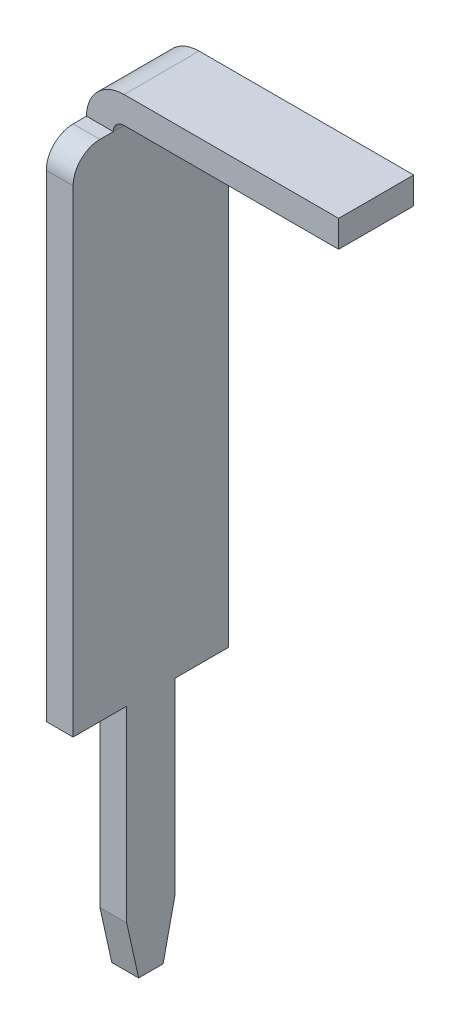
ISO-10303-21;
HEADER;
FILE_DESCRIPTION(('STEP AP214'),'2;1');
FILE_NAME('part.step','',(''),(''),'','','');
FILE_SCHEMA(('AUTOMOTIVE_DESIGN { 1 0 10303 214 1 1 1 1 }'));
ENDSEC;
DATA;
#1=APPLICATION_CONTEXT('core data for automotive mechanical design processes');
#2=APPLICATION_PROTOCOL_DEFINITION('international standard','automotive_design',2000,#1);
#3=PRODUCT_CONTEXT('',#1,'mechanical');
#4=PRODUCT('Part','Part','',(#3));
#5=PRODUCT_RELATED_PRODUCT_CATEGORY('part','',(#4));
#6=PRODUCT_DEFINITION_FORMATION('','',#4);
#7=PRODUCT_DEFINITION_CONTEXT('part definition',#1,'design');
#8=PRODUCT_DEFINITION('design','',#6,#7);
#9=PRODUCT_DEFINITION_SHAPE('','',#8);
#10=(LENGTH_UNIT() NAMED_UNIT(*) SI_UNIT(.MILLI.,.METRE.));
#11=(NAMED_UNIT(*) PLANE_ANGLE_UNIT() SI_UNIT($,.RADIAN.));
#12=(NAMED_UNIT(*) SI_UNIT($,.STERADIAN.) SOLID_ANGLE_UNIT());
#13=UNCERTAINTY_MEASURE_WITH_UNIT(LENGTH_MEASURE(1.E-05),#10,'distance_accuracy_value','');
#14=(GEOMETRIC_REPRESENTATION_CONTEXT(3) GLOBAL_UNCERTAINTY_ASSIGNED_CONTEXT((#13)) GLOBAL_UNIT_ASSIGNED_CONTEXT((#10,
#11,#12)) REPRESENTATION_CONTEXT('',''));
#15=CARTESIAN_POINT('',(0.,0.,0.));
#16=DIRECTION('',(0.,0.,1.));
#17=DIRECTION('',(1.,0.,0.));
#18=AXIS2_PLACEMENT_3D('',#15,#16,#17);
#19=CARTESIAN_POINT('',(9.828916620428,43.351554040598,2.45));
#20=DIRECTION('',(0.,-1.,0.));
#21=DIRECTION('',(0.,0.,-1.));
#22=AXIS2_PLACEMENT_3D('',#19,#20,#21);
#23=PLANE('',#22);
#24=DIRECTION('',(1.,0.,0.));
#25=VECTOR('',#24,1.);
#26=CARTESIAN_POINT('',(9.828916620428,43.351554040598,2.45));
#27=LINE('',#26,#25);
#28=CARTESIAN_POINT('',(5.003914220428,43.351554040598,2.45));
#29=VERTEX_POINT('',#28);
#30=CARTESIAN_POINT('',(9.003914220428,43.351554040598,2.45));
#31=VERTEX_POINT('',#30);
#32=EDGE_CURVE('E205',#29,#31,#27,.T.);
#33=ORIENTED_EDGE('',*,*,#32,.T.);
#34=DIRECTION('',(0.,0.,1.));
#35=VECTOR('',#34,1.);
#36=CARTESIAN_POINT('',(9.003914220428,43.351554040598,1.5));
#37=LINE('',#36,#35);
#38=CARTESIAN_POINT('',(9.003914220428,43.351554040598,1.05));
#39=VERTEX_POINT('',#38);
#40=EDGE_CURVE('E168',#31,#39,#37,.F.);
#41=ORIENTED_EDGE('',*,*,#40,.T.);
#42=DIRECTION('',(1.,0.,0.));
#43=VECTOR('',#42,1.);
#44=CARTESIAN_POINT('',(9.828916620428,43.351554040598,1.05));
#45=LINE('',#44,#43);
#46=CARTESIAN_POINT('',(5.003914220428,43.351554040598,1.05));
#47=VERTEX_POINT('',#46);
#48=EDGE_CURVE('E197',#39,#47,#45,.F.);
#49=ORIENTED_EDGE('',*,*,#48,.T.);
#50=DIRECTION('',(0.,0.,-1.));
#51=VECTOR('',#50,1.);
#52=CARTESIAN_POINT('',(5.003914220428,43.351554040598,2.45));
#53=LINE('',#52,#51);
#54=EDGE_CURVE('E216',#29,#47,#53,.T.);
#55=ORIENTED_EDGE('',*,*,#54,.F.);
#56=EDGE_LOOP('',(#33,#41,#49,#55));
#57=FACE_BOUND('',#56,.T.);
#58=ADVANCED_FACE('F17',(#57),#23,.F.);
#59=CARTESIAN_POINT('',(4.053914220428,37.701554040598,1.75));
#60=DIRECTION('',(-1.,0.,0.));
#61=DIRECTION('',(0.,0.,1.));
#62=AXIS2_PLACEMENT_3D('',#59,#60,#61);
#63=PLANE('',#62);
#64=DIRECTION('',(0.,1.,0.));
#65=VECTOR('',#64,1.);
#66=CARTESIAN_POINT('',(4.053914220428,42.220974924892,2.25));
#67=LINE('',#66,#65);
#68=CARTESIAN_POINT('',(4.053914220428,42.220974924892,2.25));
#69=VERTEX_POINT('',#68);
#70=CARTESIAN_POINT('',(4.053914220428,41.451554040598,2.25));
#71=VERTEX_POINT('',#70);
#72=EDGE_CURVE('E269',#69,#71,#67,.F.);
#73=ORIENTED_EDGE('',*,*,#72,.F.);
#74=DIRECTION('',(0.,0.,1.));
#75=VECTOR('',#74,1.);
#76=CARTESIAN_POINT('',(4.053914220428,42.220974924892,1.25));
#77=LINE('',#76,#75);
#78=CARTESIAN_POINT('',(4.053914220428,42.220974924892,1.25));
#79=VERTEX_POINT('',#78);
#80=EDGE_CURVE('E274',#79,#69,#77,.T.);
#81=ORIENTED_EDGE('',*,*,#80,.F.);
#82=DIRECTION('',(0.,1.,0.));
#83=VECTOR('',#82,1.);
#84=CARTESIAN_POINT('',(4.053914220428,41.451554040598,1.25));
#85=LINE('',#84,#83);
#86=CARTESIAN_POINT('',(4.053914220428,41.451554040598,1.25));
#87=VERTEX_POINT('',#86);
#88=EDGE_CURVE('E279',#87,#79,#85,.T.);
#89=ORIENTED_EDGE('',*,*,#88,.F.);
#90=DIRECTION('',(0.,0.,1.));
#91=VECTOR('',#90,1.);
#92=CARTESIAN_POINT('',(4.053914220428,41.451554040598,1.25));
#93=LINE('',#92,#91);
#94=EDGE_CURVE('E239',#87,#71,#93,.T.);
#95=ORIENTED_EDGE('',*,*,#94,.T.);
#96=EDGE_LOOP('',(#73,#81,#89,#95));
#97=FACE_BOUND('',#96,.T.);
#98=ADVANCED_FACE('F290',(#97),#63,.T.);
#99=CARTESIAN_POINT('',(9.003914220428,27.291551640598,1.5));
#100=DIRECTION('',(-1.,0.,0.));
#101=DIRECTION('',(0.,0.,1.));
#102=AXIS2_PLACEMENT_3D('',#99,#100,#101);
#103=PLANE('',#102);
#104=ORIENTED_EDGE('',*,*,#40,.F.);
#105=DIRECTION('',(0.,1.,0.));
#106=VECTOR('',#105,1.);
#107=CARTESIAN_POINT('',(9.003914220428,42.651554040598,2.45));
#108=LINE('',#107,#106);
#109=CARTESIAN_POINT('',(9.003914220428,42.851554040598,2.45));
#110=VERTEX_POINT('',#109);
#111=EDGE_CURVE('E198',#31,#110,#108,.F.);
#112=ORIENTED_EDGE('',*,*,#111,.T.);
#113=DIRECTION('',(0.,0.,-1.));
#114=VECTOR('',#113,1.);
#115=CARTESIAN_POINT('',(9.003914220428,42.851554040598,1.75));
#116=LINE('',#115,#114);
#117=CARTESIAN_POINT('',(9.003914220428,42.851554040598,1.05));
#118=VERTEX_POINT('',#117);
#119=EDGE_CURVE('E175',#118,#110,#116,.F.);
#120=ORIENTED_EDGE('',*,*,#119,.F.);
#121=DIRECTION('',(0.,-1.,0.));
#122=VECTOR('',#121,1.);
#123=CARTESIAN_POINT('',(9.003914220428,43.351554040598,1.05));
#124=LINE('',#123,#122);
#125=EDGE_CURVE('E194',#118,#39,#124,.F.);
#126=ORIENTED_EDGE('',*,*,#125,.T.);
#127=EDGE_LOOP('',(#104,#112,#120,#126));
#128=FACE_BOUND('',#127,.T.);
#129=ADVANCED_FACE('F490',(#128),#103,.F.);
#130=CARTESIAN_POINT('',(9.828916620428,42.651554040598,2.45));
#131=DIRECTION('',(0.,0.,-1.));
#132=DIRECTION('',(0.,1.,0.));
#133=AXIS2_PLACEMENT_3D('',#130,#131,#132);
#134=PLANE('',#133);
#135=ORIENTED_EDGE('',*,*,#32,.F.);
#136=CARTESIAN_POINT('',(5.003914220428,42.651554040598,2.45));
#137=DIRECTION('',(0.,0.,-1.));
#138=DIRECTION('',(-1.,0.,0.));
#139=AXIS2_PLACEMENT_3D('',#136,#137,#138);
#140=CIRCLE('',#139,0.7);
#141=CARTESIAN_POINT('',(4.303914220428,42.651554040598,2.45));
#142=VERTEX_POINT('',#141);
#143=EDGE_CURVE('E236',#142,#29,#140,.T.);
#144=ORIENTED_EDGE('',*,*,#143,.F.);
#145=DIRECTION('',(1.,0.,0.));
#146=VECTOR('',#145,1.);
#147=CARTESIAN_POINT('',(9.828916620428,42.651554040598,2.45));
#148=LINE('',#147,#146);
#149=CARTESIAN_POINT('',(4.803914220428,42.651554040598,2.45));
#150=VERTEX_POINT('',#149);
#151=EDGE_CURVE('E163',#150,#142,#148,.F.);
#152=ORIENTED_EDGE('',*,*,#151,.F.);
#153=CARTESIAN_POINT('',(5.003914220428,42.651554040598,2.45));
#154=DIRECTION('',(0.,0.,-1.));
#155=DIRECTION('',(-1.,0.,0.));
#156=AXIS2_PLACEMENT_3D('',#153,#154,#155);
#157=CIRCLE('',#156,0.2);
#158=CARTESIAN_POINT('',(5.003914220428,42.851554040598,2.45));
#159=VERTEX_POINT('',#158);
#160=EDGE_CURVE('E20',#159,#150,#157,.F.);
#161=ORIENTED_EDGE('',*,*,#160,.F.);
#162=DIRECTION('',(1.,0.,0.));
#163=VECTOR('',#162,1.);
#164=CARTESIAN_POINT('',(8.784298978157,42.851554040598,2.45));
#165=LINE('',#164,#163);
#166=EDGE_CURVE('E161',#110,#159,#165,.F.);
#167=ORIENTED_EDGE('',*,*,#166,.F.);
#168=ORIENTED_EDGE('',*,*,#111,.F.);
#169=EDGE_LOOP('',(#135,#144,#152,#161,#167,#168));
#170=FACE_BOUND('',#169,.T.);
#171=ADVANCED_FACE('F159',(#170),#134,.F.);
#172=CARTESIAN_POINT('',(9.828916620428,43.351554040598,1.05));
#173=DIRECTION('',(0.,0.,1.));
#174=DIRECTION('',(0.,-1.,0.));
#175=AXIS2_PLACEMENT_3D('',#172,#173,#174);
#176=PLANE('',#175);
#177=CARTESIAN_POINT('',(5.003914220428,42.651554040598,1.05));
#178=DIRECTION('',(0.,0.,-1.));
#179=DIRECTION('',(-1.,0.,0.));
#180=AXIS2_PLACEMENT_3D('',#177,#178,#179);
#181=CIRCLE('',#180,0.2);
#182=CARTESIAN_POINT('',(4.803914220428,42.651554040598,1.05));
#183=VERTEX_POINT('',#182);
#184=CARTESIAN_POINT('',(5.003914220428,42.851554040598,1.05));
#185=VERTEX_POINT('',#184);
#186=EDGE_CURVE('E180',#183,#185,#181,.T.);
#187=ORIENTED_EDGE('',*,*,#186,.F.);
#188=DIRECTION('',(1.,0.,0.));
#189=VECTOR('',#188,1.);
#190=CARTESIAN_POINT('',(9.828916620428,42.651554040598,1.05));
#191=LINE('',#190,#189);
#192=CARTESIAN_POINT('',(4.303914220428,42.651554040598,1.05));
#193=VERTEX_POINT('',#192);
#194=EDGE_CURVE('E242',#193,#183,#191,.T.);
#195=ORIENTED_EDGE('',*,*,#194,.F.);
#196=CARTESIAN_POINT('',(5.003914220428,42.651554040598,1.05));
#197=DIRECTION('',(0.,0.,-1.));
#198=DIRECTION('',(-1.,0.,0.));
#199=AXIS2_PLACEMENT_3D('',#196,#197,#198);
#200=CIRCLE('',#199,0.7);
#201=EDGE_CURVE('E240',#47,#193,#200,.F.);
#202=ORIENTED_EDGE('',*,*,#201,.F.);
#203=ORIENTED_EDGE('',*,*,#48,.F.);
#204=ORIENTED_EDGE('',*,*,#125,.F.);
#205=DIRECTION('',(1.,0.,0.));
#206=VECTOR('',#205,1.);
#207=CARTESIAN_POINT('',(8.784298978157,42.851554040598,1.05));
#208=LINE('',#207,#206);
#209=EDGE_CURVE('E177',#185,#118,#208,.T.);
#210=ORIENTED_EDGE('',*,*,#209,.F.);
#211=EDGE_LOOP('',(#187,#195,#202,#203,#204,#210));
#212=FACE_BOUND('',#211,.T.);
#213=ADVANCED_FACE('F488',(#212),#176,.F.);
#214=CARTESIAN_POINT('',(5.003914220428,42.651554040598,1.75));
#215=DIRECTION('',(0.,0.,-1.));
#216=DIRECTION('',(-1.,0.,0.));
#217=AXIS2_PLACEMENT_3D('',#214,#215,#216);
#218=CYLINDRICAL_SURFACE('',#217,0.7);
#219=ORIENTED_EDGE('',*,*,#143,.T.);
#220=ORIENTED_EDGE('',*,*,#54,.T.);
#221=ORIENTED_EDGE('',*,*,#201,.T.);
#222=DIRECTION('',(0.,0.,1.));
#223=VECTOR('',#222,1.);
#224=CARTESIAN_POINT('',(4.303914220428,42.651554040598,2.297862799032));
#225=LINE('',#224,#223);
#226=EDGE_CURVE('E253',#142,#193,#225,.F.);
#227=ORIENTED_EDGE('',*,*,#226,.F.);
#228=EDGE_LOOP('',(#219,#220,#221,#227));
#229=FACE_BOUND('',#228,.T.);
#230=ADVANCED_FACE('F484',(#229),#218,.T.);
#231=CARTESIAN_POINT('',(4.303914220428,41.451554040598,1.25));
#232=DIRECTION('',(0.,1.,0.));
#233=DIRECTION('',(0.,0.,1.));
#234=AXIS2_PLACEMENT_3D('',#231,#232,#233);
#235=PLANE('',#234);
#236=DIRECTION('',(-1.,0.,0.));
#237=VECTOR('',#236,1.);
#238=CARTESIAN_POINT('',(4.303914220428,41.451554040598,1.25));
#239=LINE('',#238,#237);
#240=CARTESIAN_POINT('',(4.303914220428,41.451554040598,1.25));
#241=VERTEX_POINT('',#240);
#242=EDGE_CURVE('E280',#241,#87,#239,.T.);
#243=ORIENTED_EDGE('',*,*,#242,.F.);
#244=DIRECTION('',(0.,0.,1.));
#245=VECTOR('',#244,1.);
#246=CARTESIAN_POINT('',(4.303914220428,41.451554040598,2.297862799032));
#247=LINE('',#246,#245);
#248=CARTESIAN_POINT('',(4.303914220428,41.451554040598,2.25));
#249=VERTEX_POINT('',#248);
#250=EDGE_CURVE('E255',#249,#241,#247,.F.);
#251=ORIENTED_EDGE('',*,*,#250,.F.);
#252=DIRECTION('',(1.,0.,0.));
#253=VECTOR('',#252,1.);
#254=CARTESIAN_POINT('',(4.303914220428,41.451554040598,2.25));
#255=LINE('',#254,#253);
#256=EDGE_CURVE('E202',#71,#249,#255,.T.);
#257=ORIENTED_EDGE('',*,*,#256,.F.);
#258=ORIENTED_EDGE('',*,*,#94,.F.);
#259=EDGE_LOOP('',(#243,#251,#257,#258));
#260=FACE_BOUND('',#259,.T.);
#261=ADVANCED_FACE('F294',(#260),#235,.F.);
#262=CARTESIAN_POINT('',(4.303914220428,41.451554040598,1.25));
#263=DIRECTION('',(0.,0.,-1.));
#264=DIRECTION('',(-1.,0.,0.));
#265=AXIS2_PLACEMENT_3D('',#262,#263,#264);
#266=PLANE('',#265);
#267=ORIENTED_EDGE('',*,*,#88,.T.);
#268=DIRECTION('',(1.,0.,0.));
#269=VECTOR('',#268,1.);
#270=CARTESIAN_POINT('',(4.303914220428,42.220974924892,1.25));
#271=LINE('',#270,#269);
#272=CARTESIAN_POINT('',(4.303914220428,42.220974924892,1.25));
#273=VERTEX_POINT('',#272);
#274=EDGE_CURVE('E276',#273,#79,#271,.F.);
#275=ORIENTED_EDGE('',*,*,#274,.F.);
#276=DIRECTION('',(0.,1.,0.));
#277=VECTOR('',#276,1.);
#278=CARTESIAN_POINT('',(4.303914220428,38.766714055573,1.25));
#279=LINE('',#278,#277);
#280=EDGE_CURVE('E262',#241,#273,#279,.T.);
#281=ORIENTED_EDGE('',*,*,#280,.F.);
#282=ORIENTED_EDGE('',*,*,#242,.T.);
#283=EDGE_LOOP('',(#267,#275,#281,#282));
#284=FACE_BOUND('',#283,.T.);
#285=ADVANCED_FACE('F539',(#284),#266,.T.);
#286=CARTESIAN_POINT('',(4.303914220428,42.220974924892,1.25));
#287=DIRECTION('',(0.,1.,0.));
#288=DIRECTION('',(0.,0.,1.));
#289=AXIS2_PLACEMENT_3D('',#286,#287,#288);
#290=PLANE('',#289);
#291=ORIENTED_EDGE('',*,*,#80,.T.);
#292=DIRECTION('',(1.,0.,0.));
#293=VECTOR('',#292,1.);
#294=CARTESIAN_POINT('',(4.303914220428,42.220974924892,2.25));
#295=LINE('',#294,#293);
#296=CARTESIAN_POINT('',(4.303914220428,42.220974924892,2.25));
#297=VERTEX_POINT('',#296);
#298=EDGE_CURVE('E271',#297,#69,#295,.F.);
#299=ORIENTED_EDGE('',*,*,#298,.F.);
#300=DIRECTION('',(0.,0.,1.));
#301=VECTOR('',#300,1.);
#302=CARTESIAN_POINT('',(4.303914220428,42.220974924892,2.297862799032));
#303=LINE('',#302,#301);
#304=EDGE_CURVE('E304',#273,#297,#303,.T.);
#305=ORIENTED_EDGE('',*,*,#304,.F.);
#306=ORIENTED_EDGE('',*,*,#274,.T.);
#307=EDGE_LOOP('',(#291,#299,#305,#306));
#308=FACE_BOUND('',#307,.T.);
#309=ADVANCED_FACE('F536',(#308),#290,.T.);
#310=CARTESIAN_POINT('',(4.303914220428,42.220974924892,2.25));
#311=DIRECTION('',(0.,0.,1.));
#312=DIRECTION('',(1.,0.,0.));
#313=AXIS2_PLACEMENT_3D('',#310,#311,#312);
#314=PLANE('',#313);
#315=ORIENTED_EDGE('',*,*,#72,.T.);
#316=ORIENTED_EDGE('',*,*,#256,.T.);
#317=DIRECTION('',(0.,1.,0.));
#318=VECTOR('',#317,1.);
#319=CARTESIAN_POINT('',(4.303914220428,38.766714055573,2.25));
#320=LINE('',#319,#318);
#321=EDGE_CURVE('E235',#297,#249,#320,.F.);
#322=ORIENTED_EDGE('',*,*,#321,.F.);
#323=ORIENTED_EDGE('',*,*,#298,.T.);
#324=EDGE_LOOP('',(#315,#316,#322,#323));
#325=FACE_BOUND('',#324,.T.);
#326=ADVANCED_FACE('F298',(#325),#314,.T.);
#327=CARTESIAN_POINT('',(8.784298978157,42.851554040598,1.75));
#328=DIRECTION('',(0.,-1.,0.));
#329=DIRECTION('',(0.,0.,-1.));
#330=AXIS2_PLACEMENT_3D('',#327,#328,#329);
#331=PLANE('',#330);
#332=DIRECTION('',(0.,0.,-1.));
#333=VECTOR('',#332,1.);
#334=CARTESIAN_POINT('',(5.003914220428,42.851554040598,1.75));
#335=LINE('',#334,#333);
#336=EDGE_CURVE('E173',#159,#185,#335,.T.);
#337=ORIENTED_EDGE('',*,*,#336,.T.);
#338=ORIENTED_EDGE('',*,*,#209,.T.);
#339=ORIENTED_EDGE('',*,*,#119,.T.);
#340=ORIENTED_EDGE('',*,*,#166,.T.);
#341=EDGE_LOOP('',(#337,#338,#339,#340));
#342=FACE_BOUND('',#341,.T.);
#343=ADVANCED_FACE('F171',(#342),#331,.T.);
#344=CARTESIAN_POINT('',(4.303914220428,38.766714055573,2.297862799032));
#345=DIRECTION('',(-1.,0.,0.));
#346=DIRECTION('',(0.,0.,1.));
#347=AXIS2_PLACEMENT_3D('',#344,#345,#346);
#348=PLANE('',#347);
#349=ORIENTED_EDGE('',*,*,#304,.T.);
#350=ORIENTED_EDGE('',*,*,#321,.T.);
#351=ORIENTED_EDGE('',*,*,#250,.T.);
#352=ORIENTED_EDGE('',*,*,#280,.T.);
#353=EDGE_LOOP('',(#349,#350,#351,#352));
#354=FACE_BOUND('',#353,.T.);
#355=DIRECTION('',(0.,0.,1.));
#356=VECTOR('',#355,1.);
#357=CARTESIAN_POINT('',(4.303914220428,33.251554040598,2.2));
#358=LINE('',#357,#356);
#359=CARTESIAN_POINT('',(4.303914220428,33.251554040598,2.2));
#360=VERTEX_POINT('',#359);
#361=CARTESIAN_POINT('',(4.303914220428,33.251554040598,3.2));
#362=VERTEX_POINT('',#361);
#363=EDGE_CURVE('E315',#360,#362,#358,.T.);
#364=ORIENTED_EDGE('',*,*,#363,.T.);
#365=DIRECTION('',(0.,1.,0.));
#366=VECTOR('',#365,1.);
#367=CARTESIAN_POINT('',(4.303914220428,33.251554040598,3.2));
#368=LINE('',#367,#366);
#369=CARTESIAN_POINT('',(4.303914220428,42.151554040598,3.2));
#370=VERTEX_POINT('',#369);
#371=EDGE_CURVE('E230',#362,#370,#368,.T.);
#372=ORIENTED_EDGE('',*,*,#371,.T.);
#373=CARTESIAN_POINT('',(4.303914220428,42.151554040598,2.7));
#374=DIRECTION('',(-1.,0.,0.));
#375=DIRECTION('',(0.,0.,1.));
#376=AXIS2_PLACEMENT_3D('',#373,#374,#375);
#377=CIRCLE('',#376,0.5);
#378=CARTESIAN_POINT('',(4.303914220428,42.651554040598,2.7));
#379=VERTEX_POINT('',#378);
#380=EDGE_CURVE('E233',#379,#370,#377,.F.);
#381=ORIENTED_EDGE('',*,*,#380,.F.);
#382=DIRECTION('',(0.,0.,1.));
#383=VECTOR('',#382,1.);
#384=CARTESIAN_POINT('',(4.303914220428,42.651554040598,2.7));
#385=LINE('',#384,#383);
#386=EDGE_CURVE('E188',#142,#379,#385,.T.);
#387=ORIENTED_EDGE('',*,*,#386,.F.);
#388=ORIENTED_EDGE('',*,*,#226,.T.);
#389=DIRECTION('',(0.,0.,1.));
#390=VECTOR('',#389,1.);
#391=CARTESIAN_POINT('',(4.303914220428,42.651554040598,1.05));
#392=LINE('',#391,#390);
#393=CARTESIAN_POINT('',(4.303914220428,42.651554040598,0.8));
#394=VERTEX_POINT('',#393);
#395=EDGE_CURVE('E182',#394,#193,#392,.T.);
#396=ORIENTED_EDGE('',*,*,#395,.F.);
#397=CARTESIAN_POINT('',(4.303914220428,42.151554040598,0.8));
#398=DIRECTION('',(-1.,0.,0.));
#399=DIRECTION('',(0.,0.,1.));
#400=AXIS2_PLACEMENT_3D('',#397,#398,#399);
#401=CIRCLE('',#400,0.5);
#402=CARTESIAN_POINT('',(4.303914220428,42.151554040598,0.3));
#403=VERTEX_POINT('',#402);
#404=EDGE_CURVE('E186',#403,#394,#401,.F.);
#405=ORIENTED_EDGE('',*,*,#404,.F.);
#406=DIRECTION('',(0.,-1.,0.));
#407=VECTOR('',#406,1.);
#408=CARTESIAN_POINT('',(4.303914220428,42.151554040598,0.3));
#409=LINE('',#408,#407);
#410=CARTESIAN_POINT('',(4.303914220428,33.251554040598,0.3));
#411=VERTEX_POINT('',#410);
#412=EDGE_CURVE('E351',#403,#411,#409,.T.);
#413=ORIENTED_EDGE('',*,*,#412,.T.);
#414=DIRECTION('',(0.,0.,1.));
#415=VECTOR('',#414,1.);
#416=CARTESIAN_POINT('',(4.303914220428,33.251554040598,0.3));
#417=LINE('',#416,#415);
#418=CARTESIAN_POINT('',(4.303914220428,33.251554040598,1.3));
#419=VERTEX_POINT('',#418);
#420=EDGE_CURVE('E346',#411,#419,#417,.T.);
#421=ORIENTED_EDGE('',*,*,#420,.T.);
#422=DIRECTION('',(0.,-1.,0.));
#423=VECTOR('',#422,1.);
#424=CARTESIAN_POINT('',(4.303914220428,33.251554040598,1.3));
#425=LINE('',#424,#423);
#426=CARTESIAN_POINT('',(4.303914220428,29.751554040598,1.3));
#427=VERTEX_POINT('',#426);
#428=EDGE_CURVE('E341',#419,#427,#425,.T.);
#429=ORIENTED_EDGE('',*,*,#428,.T.);
#430=DIRECTION('',(0.,-0.976296007119958,0.216439613937991));
#431=VECTOR('',#430,1.);
#432=CARTESIAN_POINT('',(4.303914220428,29.751554040598,1.3));
#433=LINE('',#432,#431);
#434=CARTESIAN_POINT('',(4.303914220428,28.751554040598,1.52169466264294));
#435=VERTEX_POINT('',#434);
#436=EDGE_CURVE('E336',#427,#435,#433,.T.);
#437=ORIENTED_EDGE('',*,*,#436,.T.);
#438=DIRECTION('',(0.,0.,1.));
#439=VECTOR('',#438,1.);
#440=CARTESIAN_POINT('',(4.303914220428,28.751554040598,1.521694662643));
#441=LINE('',#440,#439);
#442=CARTESIAN_POINT('',(4.303914220428,28.751554040598,1.978305337357));
#443=VERTEX_POINT('',#442);
#444=EDGE_CURVE('E331',#435,#443,#441,.T.);
#445=ORIENTED_EDGE('',*,*,#444,.T.);
#446=DIRECTION('',(0.,0.976296007119958,0.216439613937991));
#447=VECTOR('',#446,1.);
#448=CARTESIAN_POINT('',(4.303914220428,28.751554040598,1.978305337357));
#449=LINE('',#448,#447);
#450=CARTESIAN_POINT('',(4.303914220428,29.751554040598,2.19999999999994));
#451=VERTEX_POINT('',#450);
#452=EDGE_CURVE('E326',#443,#451,#449,.T.);
#453=ORIENTED_EDGE('',*,*,#452,.T.);
#454=DIRECTION('',(0.,1.,0.));
#455=VECTOR('',#454,1.);
#456=CARTESIAN_POINT('',(4.303914220428,29.751554040598,2.2));
#457=LINE('',#456,#455);
#458=EDGE_CURVE('E321',#451,#360,#457,.T.);
#459=ORIENTED_EDGE('',*,*,#458,.T.);
#460=EDGE_LOOP('',(#364,#372,#381,#387,#388,#396,#405,#413,#421,#429,#437,#445,#453,#459));
#461=FACE_BOUND('',#460,.T.);
#462=ADVANCED_FACE('F301',(#354,#461),#348,.T.);
#463=CARTESIAN_POINT('',(4.303914220428,42.151554040598,2.7));
#464=DIRECTION('',(-1.,0.,0.));
#465=DIRECTION('',(0.,0.,1.));
#466=AXIS2_PLACEMENT_3D('',#463,#464,#465);
#467=CYLINDRICAL_SURFACE('',#466,0.5);
#468=CARTESIAN_POINT('',(4.803914220428,42.151554040598,2.7));
#469=DIRECTION('',(-1.,0.,0.));
#470=DIRECTION('',(0.,0.,1.));
#471=AXIS2_PLACEMENT_3D('',#468,#469,#470);
#472=CIRCLE('',#471,0.5);
#473=CARTESIAN_POINT('',(4.803914220428,42.151554040598,3.2));
#474=VERTEX_POINT('',#473);
#475=CARTESIAN_POINT('',(4.803914220428,42.651554040598,2.7));
#476=VERTEX_POINT('',#475);
#477=EDGE_CURVE('E226',#474,#476,#472,.T.);
#478=ORIENTED_EDGE('',*,*,#477,.T.);
#479=DIRECTION('',(1.,0.,0.));
#480=VECTOR('',#479,1.);
#481=CARTESIAN_POINT('',(4.303914220428,42.651554040598,2.7));
#482=LINE('',#481,#480);
#483=EDGE_CURVE('E183',#379,#476,#482,.T.);
#484=ORIENTED_EDGE('',*,*,#483,.F.);
#485=ORIENTED_EDGE('',*,*,#380,.T.);
#486=DIRECTION('',(1.,0.,0.));
#487=VECTOR('',#486,1.);
#488=CARTESIAN_POINT('',(9.828916620428,42.151554040598,3.2));
#489=LINE('',#488,#487);
#490=EDGE_CURVE('E317',#370,#474,#489,.T.);
#491=ORIENTED_EDGE('',*,*,#490,.T.);
#492=EDGE_LOOP('',(#478,#484,#485,#491));
#493=FACE_BOUND('',#492,.T.);
#494=ADVANCED_FACE('F455',(#493),#467,.T.);
#495=CARTESIAN_POINT('',(4.303914220428,42.651554040598,2.7));
#496=DIRECTION('',(0.,1.,0.));
#497=DIRECTION('',(0.,0.,1.));
#498=AXIS2_PLACEMENT_3D('',#495,#496,#497);
#499=PLANE('',#498);
#500=DIRECTION('',(0.,0.,1.));
#501=VECTOR('',#500,1.);
#502=CARTESIAN_POINT('',(4.803914220428,42.651554040598,2.297862799032));
#503=LINE('',#502,#501);
#504=EDGE_CURVE('E229',#476,#150,#503,.F.);
#505=ORIENTED_EDGE('',*,*,#504,.T.);
#506=ORIENTED_EDGE('',*,*,#151,.T.);
#507=ORIENTED_EDGE('',*,*,#386,.T.);
#508=ORIENTED_EDGE('',*,*,#483,.T.);
#509=EDGE_LOOP('',(#505,#506,#507,#508));
#510=FACE_BOUND('',#509,.T.);
#511=ADVANCED_FACE('F482',(#510),#499,.T.);
#512=CARTESIAN_POINT('',(5.003914220428,42.651554040598,1.75));
#513=DIRECTION('',(0.,0.,-1.));
#514=DIRECTION('',(-1.,0.,0.));
#515=AXIS2_PLACEMENT_3D('',#512,#513,#514);
#516=CYLINDRICAL_SURFACE('',#515,0.2);
#517=ORIENTED_EDGE('',*,*,#336,.F.);
#518=ORIENTED_EDGE('',*,*,#160,.T.);
#519=DIRECTION('',(0.,0.,1.));
#520=VECTOR('',#519,1.);
#521=CARTESIAN_POINT('',(4.803914220428,42.651554040598,2.297862799032));
#522=LINE('',#521,#520);
#523=EDGE_CURVE('E364',#150,#183,#522,.F.);
#524=ORIENTED_EDGE('',*,*,#523,.T.);
#525=ORIENTED_EDGE('',*,*,#186,.T.);
#526=EDGE_LOOP('',(#517,#518,#524,#525));
#527=FACE_BOUND('',#526,.T.);
#528=ADVANCED_FACE('F179',(#527),#516,.F.);
#529=CARTESIAN_POINT('',(4.303914220428,42.651554040598,1.05));
#530=DIRECTION('',(0.,1.,0.));
#531=DIRECTION('',(0.,0.,1.));
#532=AXIS2_PLACEMENT_3D('',#529,#530,#531);
#533=PLANE('',#532);
#534=DIRECTION('',(0.,0.,1.));
#535=VECTOR('',#534,1.);
#536=CARTESIAN_POINT('',(4.803914220428,42.651554040598,2.297862799032));
#537=LINE('',#536,#535);
#538=CARTESIAN_POINT('',(4.803914220428,42.651554040598,0.8));
#539=VERTEX_POINT('',#538);
#540=EDGE_CURVE('E225',#183,#539,#537,.F.);
#541=ORIENTED_EDGE('',*,*,#540,.T.);
#542=DIRECTION('',(-1.,0.,0.));
#543=VECTOR('',#542,1.);
#544=CARTESIAN_POINT('',(4.303914220428,42.651554040598,0.8));
#545=LINE('',#544,#543);
#546=EDGE_CURVE('E232',#394,#539,#545,.F.);
#547=ORIENTED_EDGE('',*,*,#546,.F.);
#548=ORIENTED_EDGE('',*,*,#395,.T.);
#549=ORIENTED_EDGE('',*,*,#194,.T.);
#550=EDGE_LOOP('',(#541,#547,#548,#549));
#551=FACE_BOUND('',#550,.T.);
#552=ADVANCED_FACE('F452',(#551),#533,.T.);
#553=CARTESIAN_POINT('',(4.303914220428,42.151554040598,0.8));
#554=DIRECTION('',(-1.,0.,0.));
#555=DIRECTION('',(0.,0.,1.));
#556=AXIS2_PLACEMENT_3D('',#553,#554,#555);
#557=CYLINDRICAL_SURFACE('',#556,0.5);
#558=CARTESIAN_POINT('',(4.803914220428,42.151554040598,0.8));
#559=DIRECTION('',(-1.,0.,0.));
#560=DIRECTION('',(0.,0.,1.));
#561=AXIS2_PLACEMENT_3D('',#558,#559,#560);
#562=CIRCLE('',#561,0.5);
#563=CARTESIAN_POINT('',(4.803914220428,42.151554040598,0.3));
#564=VERTEX_POINT('',#563);
#565=EDGE_CURVE('E221',#539,#564,#562,.T.);
#566=ORIENTED_EDGE('',*,*,#565,.T.);
#567=DIRECTION('',(1.,0.,0.));
#568=VECTOR('',#567,1.);
#569=CARTESIAN_POINT('',(9.828916620428,42.151554040598,0.3));
#570=LINE('',#569,#568);
#571=EDGE_CURVE('E352',#564,#403,#570,.F.);
#572=ORIENTED_EDGE('',*,*,#571,.T.);
#573=ORIENTED_EDGE('',*,*,#404,.T.);
#574=ORIENTED_EDGE('',*,*,#546,.T.);
#575=EDGE_LOOP('',(#566,#572,#573,#574));
#576=FACE_BOUND('',#575,.T.);
#577=ADVANCED_FACE('F450',(#576),#557,.T.);
#578=CARTESIAN_POINT('',(9.828916620428,42.151554040598,0.3));
#579=DIRECTION('',(0.,0.,1.));
#580=DIRECTION('',(0.,-1.,0.));
#581=AXIS2_PLACEMENT_3D('',#578,#579,#580);
#582=PLANE('',#581);
#583=DIRECTION('',(1.,0.,0.));
#584=VECTOR('',#583,1.);
#585=CARTESIAN_POINT('',(9.828916620428,33.251554040598,0.3));
#586=LINE('',#585,#584);
#587=CARTESIAN_POINT('',(4.803914220428,33.251554040598,0.3));
#588=VERTEX_POINT('',#587);
#589=EDGE_CURVE('E348',#588,#411,#586,.F.);
#590=ORIENTED_EDGE('',*,*,#589,.T.);
#591=ORIENTED_EDGE('',*,*,#412,.F.);
#592=ORIENTED_EDGE('',*,*,#571,.F.);
#593=DIRECTION('',(0.,1.,0.));
#594=VECTOR('',#593,1.);
#595=CARTESIAN_POINT('',(4.803914220428,38.766714055573,0.3));
#596=LINE('',#595,#594);
#597=EDGE_CURVE('E224',#564,#588,#596,.F.);
#598=ORIENTED_EDGE('',*,*,#597,.T.);
#599=EDGE_LOOP('',(#590,#591,#592,#598));
#600=FACE_BOUND('',#599,.T.);
#601=ADVANCED_FACE('F444',(#600),#582,.F.);
#602=CARTESIAN_POINT('',(9.828916620428,33.251554040598,0.3));
#603=DIRECTION('',(0.,1.,0.));
#604=DIRECTION('',(0.,0.,1.));
#605=AXIS2_PLACEMENT_3D('',#602,#603,#604);
#606=PLANE('',#605);
#607=ORIENTED_EDGE('',*,*,#589,.F.);
#608=DIRECTION('',(0.,0.,1.));
#609=VECTOR('',#608,1.);
#610=CARTESIAN_POINT('',(4.803914220428,33.251554040598,2.297862799032));
#611=LINE('',#610,#609);
#612=CARTESIAN_POINT('',(4.803914220428,33.251554040598,1.3));
#613=VERTEX_POINT('',#612);
#614=EDGE_CURVE('E425',#588,#613,#611,.T.);
#615=ORIENTED_EDGE('',*,*,#614,.T.);
#616=DIRECTION('',(1.,0.,0.));
#617=VECTOR('',#616,1.);
#618=CARTESIAN_POINT('',(9.828916620428,33.251554040598,1.3));
#619=LINE('',#618,#617);
#620=EDGE_CURVE('E343',#613,#419,#619,.F.);
#621=ORIENTED_EDGE('',*,*,#620,.T.);
#622=ORIENTED_EDGE('',*,*,#420,.F.);
#623=EDGE_LOOP('',(#607,#615,#621,#622));
#624=FACE_BOUND('',#623,.T.);
#625=ADVANCED_FACE('F481',(#624),#606,.F.);
#626=CARTESIAN_POINT('',(9.828916620428,33.251554040598,1.3));
#627=DIRECTION('',(0.,0.,1.));
#628=DIRECTION('',(0.,-1.,0.));
#629=AXIS2_PLACEMENT_3D('',#626,#627,#628);
#630=PLANE('',#629);
#631=ORIENTED_EDGE('',*,*,#620,.F.);
#632=DIRECTION('',(0.,1.,0.));
#633=VECTOR('',#632,1.);
#634=CARTESIAN_POINT('',(4.803914220428,38.766714055573,1.3));
#635=LINE('',#634,#633);
#636=CARTESIAN_POINT('',(4.803914220428,29.751554040598,1.3));
#637=VERTEX_POINT('',#636);
#638=EDGE_CURVE('E416',#613,#637,#635,.F.);
#639=ORIENTED_EDGE('',*,*,#638,.T.);
#640=DIRECTION('',(1.,0.,0.));
#641=VECTOR('',#640,1.);
#642=CARTESIAN_POINT('',(9.828916620428,29.751554040598,1.3));
#643=LINE('',#642,#641);
#644=EDGE_CURVE('E338',#637,#427,#643,.F.);
#645=ORIENTED_EDGE('',*,*,#644,.T.);
#646=ORIENTED_EDGE('',*,*,#428,.F.);
#647=EDGE_LOOP('',(#631,#639,#645,#646));
#648=FACE_BOUND('',#647,.T.);
#649=ADVANCED_FACE('F480',(#648),#630,.F.);
#650=CARTESIAN_POINT('',(9.828916620428,29.751554040598,1.3));
#651=DIRECTION('',(0.,0.216439613937991,0.976296007119958));
#652=DIRECTION('',(0.,-0.976296007119958,0.216439613937991));
#653=AXIS2_PLACEMENT_3D('',#650,#651,#652);
#654=PLANE('',#653);
#655=ORIENTED_EDGE('',*,*,#644,.F.);
#656=DIRECTION('',(0.,-0.976296007119921,0.216439613938158));
#657=VECTOR('',#656,1.);
#658=CARTESIAN_POINT('',(4.803914220428,29.751554040598,1.3));
#659=LINE('',#658,#657);
#660=CARTESIAN_POINT('',(4.803914220428,28.751554040598,1.521694662643));
#661=VERTEX_POINT('',#660);
#662=EDGE_CURVE('E407',#637,#661,#659,.T.);
#663=ORIENTED_EDGE('',*,*,#662,.T.);
#664=DIRECTION('',(1.,0.,0.));
#665=VECTOR('',#664,1.);
#666=CARTESIAN_POINT('',(9.828916620428,28.751554040598,1.521694662643));
#667=LINE('',#666,#665);
#668=EDGE_CURVE('E333',#661,#435,#667,.F.);
#669=ORIENTED_EDGE('',*,*,#668,.T.);
#670=ORIENTED_EDGE('',*,*,#436,.F.);
#671=EDGE_LOOP('',(#655,#663,#669,#670));
#672=FACE_BOUND('',#671,.T.);
#673=ADVANCED_FACE('F476',(#672),#654,.F.);
#674=CARTESIAN_POINT('',(9.828916620428,28.751554040598,1.521694662643));
#675=DIRECTION('',(0.,1.,0.));
#676=DIRECTION('',(0.,0.,1.));
#677=AXIS2_PLACEMENT_3D('',#674,#675,#676);
#678=PLANE('',#677);
#679=ORIENTED_EDGE('',*,*,#668,.F.);
#680=DIRECTION('',(0.,0.,1.));
#681=VECTOR('',#680,1.);
#682=CARTESIAN_POINT('',(4.803914220428,28.751554040598,2.297862799032));
#683=LINE('',#682,#681);
#684=CARTESIAN_POINT('',(4.803914220428,28.751554040598,1.978305337357));
#685=VERTEX_POINT('',#684);
#686=EDGE_CURVE('E398',#661,#685,#683,.T.);
#687=ORIENTED_EDGE('',*,*,#686,.T.);
#688=DIRECTION('',(1.,0.,0.));
#689=VECTOR('',#688,1.);
#690=CARTESIAN_POINT('',(9.828916620428,28.751554040598,1.978305337357));
#691=LINE('',#690,#689);
#692=EDGE_CURVE('E328',#685,#443,#691,.F.);
#693=ORIENTED_EDGE('',*,*,#692,.T.);
#694=ORIENTED_EDGE('',*,*,#444,.F.);
#695=EDGE_LOOP('',(#679,#687,#693,#694));
#696=FACE_BOUND('',#695,.T.);
#697=ADVANCED_FACE('F473',(#696),#678,.F.);
#698=CARTESIAN_POINT('',(9.828916620428,28.751554040598,1.978305337357));
#699=DIRECTION('',(0.,0.216439613937991,-0.976296007119958));
#700=DIRECTION('',(0.,0.976296007119958,0.216439613937991));
#701=AXIS2_PLACEMENT_3D('',#698,#699,#700);
#702=PLANE('',#701);
#703=DIRECTION('',(1.,0.,0.));
#704=VECTOR('',#703,1.);
#705=CARTESIAN_POINT('',(9.828916620428,29.751554040598,2.2));
#706=LINE('',#705,#704);
#707=CARTESIAN_POINT('',(4.803914220428,29.751554040598,2.2));
#708=VERTEX_POINT('',#707);
#709=EDGE_CURVE('E323',#708,#451,#706,.F.);
#710=ORIENTED_EDGE('',*,*,#709,.T.);
#711=ORIENTED_EDGE('',*,*,#452,.F.);
#712=ORIENTED_EDGE('',*,*,#692,.F.);
#713=DIRECTION('',(0.,0.976296007119921,0.216439613938159));
#714=VECTOR('',#713,1.);
#715=CARTESIAN_POINT('',(4.803914220428,28.751554040598,1.978305337357));
#716=LINE('',#715,#714);
#717=EDGE_CURVE('E389',#685,#708,#716,.T.);
#718=ORIENTED_EDGE('',*,*,#717,.T.);
#719=EDGE_LOOP('',(#710,#711,#712,#718));
#720=FACE_BOUND('',#719,.T.);
#721=ADVANCED_FACE('F469',(#720),#702,.F.);
#722=CARTESIAN_POINT('',(9.828916620428,29.751554040598,2.2));
#723=DIRECTION('',(0.,0.,-1.));
#724=DIRECTION('',(0.,1.,0.));
#725=AXIS2_PLACEMENT_3D('',#722,#723,#724);
#726=PLANE('',#725);
#727=ORIENTED_EDGE('',*,*,#709,.F.);
#728=DIRECTION('',(0.,1.,0.));
#729=VECTOR('',#728,1.);
#730=CARTESIAN_POINT('',(4.803914220428,38.766714055573,2.2));
#731=LINE('',#730,#729);
#732=CARTESIAN_POINT('',(4.803914220428,33.251554040598,2.2));
#733=VERTEX_POINT('',#732);
#734=EDGE_CURVE('E380',#708,#733,#731,.T.);
#735=ORIENTED_EDGE('',*,*,#734,.T.);
#736=DIRECTION('',(1.,0.,0.));
#737=VECTOR('',#736,1.);
#738=CARTESIAN_POINT('',(9.828916620428,33.251554040598,2.2));
#739=LINE('',#738,#737);
#740=EDGE_CURVE('E318',#733,#360,#739,.F.);
#741=ORIENTED_EDGE('',*,*,#740,.T.);
#742=ORIENTED_EDGE('',*,*,#458,.F.);
#743=EDGE_LOOP('',(#727,#735,#741,#742));
#744=FACE_BOUND('',#743,.T.);
#745=ADVANCED_FACE('F465',(#744),#726,.F.);
#746=CARTESIAN_POINT('',(9.828916620428,33.251554040598,2.2));
#747=DIRECTION('',(0.,1.,0.));
#748=DIRECTION('',(0.,0.,1.));
#749=AXIS2_PLACEMENT_3D('',#746,#747,#748);
#750=PLANE('',#749);
#751=ORIENTED_EDGE('',*,*,#740,.F.);
#752=DIRECTION('',(0.,0.,1.));
#753=VECTOR('',#752,1.);
#754=CARTESIAN_POINT('',(4.803914220428,33.251554040598,2.297862799032));
#755=LINE('',#754,#753);
#756=CARTESIAN_POINT('',(4.803914220428,33.251554040598,3.2));
#757=VERTEX_POINT('',#756);
#758=EDGE_CURVE('E26',#733,#757,#755,.T.);
#759=ORIENTED_EDGE('',*,*,#758,.T.);
#760=DIRECTION('',(1.,0.,0.));
#761=VECTOR('',#760,1.);
#762=CARTESIAN_POINT('',(9.828916620428,33.251554040598,3.2));
#763=LINE('',#762,#761);
#764=EDGE_CURVE('E34',#757,#362,#763,.F.);
#765=ORIENTED_EDGE('',*,*,#764,.T.);
#766=ORIENTED_EDGE('',*,*,#363,.F.);
#767=EDGE_LOOP('',(#751,#759,#765,#766));
#768=FACE_BOUND('',#767,.T.);
#769=ADVANCED_FACE('F461',(#768),#750,.F.);
#770=CARTESIAN_POINT('',(9.828916620428,33.251554040598,3.2));
#771=DIRECTION('',(0.,0.,-1.));
#772=DIRECTION('',(0.,1.,0.));
#773=AXIS2_PLACEMENT_3D('',#770,#771,#772);
#774=PLANE('',#773);
#775=ORIENTED_EDGE('',*,*,#764,.F.);
#776=DIRECTION('',(0.,1.,0.));
#777=VECTOR('',#776,1.);
#778=CARTESIAN_POINT('',(4.803914220428,38.766714055573,3.2));
#779=LINE('',#778,#777);
#780=EDGE_CURVE('E11',#757,#474,#779,.T.);
#781=ORIENTED_EDGE('',*,*,#780,.T.);
#782=ORIENTED_EDGE('',*,*,#490,.F.);
#783=ORIENTED_EDGE('',*,*,#371,.F.);
#784=EDGE_LOOP('',(#775,#781,#782,#783));
#785=FACE_BOUND('',#784,.T.);
#786=ADVANCED_FACE('F458',(#785),#774,.F.);
#787=CARTESIAN_POINT('',(4.803914220428,38.766714055573,2.297862799032));
#788=DIRECTION('',(-1.,0.,0.));
#789=DIRECTION('',(0.,0.,1.));
#790=AXIS2_PLACEMENT_3D('',#787,#788,#789);
#791=PLANE('',#790);
#792=ORIENTED_EDGE('',*,*,#758,.F.);
#793=ORIENTED_EDGE('',*,*,#734,.F.);
#794=ORIENTED_EDGE('',*,*,#717,.F.);
#795=ORIENTED_EDGE('',*,*,#686,.F.);
#796=ORIENTED_EDGE('',*,*,#662,.F.);
#797=ORIENTED_EDGE('',*,*,#638,.F.);
#798=ORIENTED_EDGE('',*,*,#614,.F.);
#799=ORIENTED_EDGE('',*,*,#597,.F.);
#800=ORIENTED_EDGE('',*,*,#565,.F.);
#801=ORIENTED_EDGE('',*,*,#540,.F.);
#802=ORIENTED_EDGE('',*,*,#523,.F.);
#803=ORIENTED_EDGE('',*,*,#504,.F.);
#804=ORIENTED_EDGE('',*,*,#477,.F.);
#805=ORIENTED_EDGE('',*,*,#780,.F.);
#806=EDGE_LOOP('',(#792,#793,#794,#795,#796,#797,#798,#799,#800,#801,#802,#803,#804,#805));
#807=FACE_BOUND('',#806,.T.);
#808=ADVANCED_FACE('F448',(#807),#791,.F.);
#809=CLOSED_SHELL('',(#58,#98,#129,#171,#213,#230,#261,#285,#309,#326,#343,#462,#494,#511,#528,
#552,#577,#601,#625,#649,#673,#697,#721,#745,#769,#786,#808));
#810=MANIFOLD_SOLID_BREP('B1',#809);
#811=ADVANCED_BREP_SHAPE_REPRESENTATION('',(#18,#810),#14);
#812=SHAPE_DEFINITION_REPRESENTATION(#9,#811);
ENDSEC;
END-ISO-10303-21;
